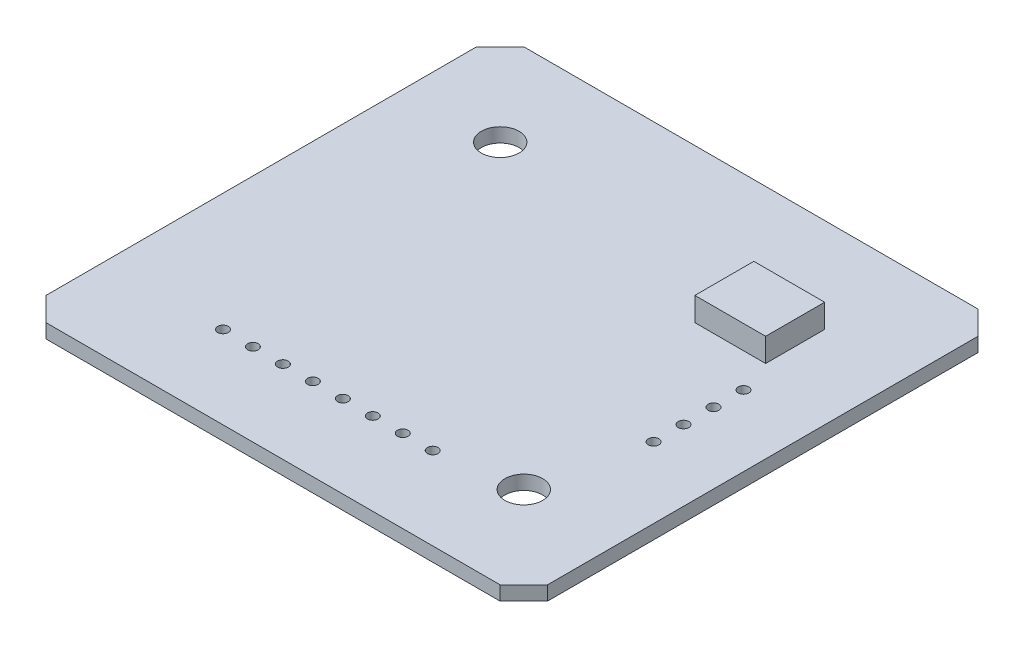
ISO-10303-21;
HEADER;
FILE_DESCRIPTION(('STEP AP214'),'2;1');
FILE_NAME('part.step','',(''),(''),'','','');
FILE_SCHEMA(('AUTOMOTIVE_DESIGN { 1 0 10303 214 1 1 1 1 }'));
ENDSEC;
DATA;
#1=APPLICATION_CONTEXT('core data for automotive mechanical design processes');
#2=APPLICATION_PROTOCOL_DEFINITION('international standard','automotive_design',2000,#1);
#3=PRODUCT_CONTEXT('',#1,'mechanical');
#4=PRODUCT('Part','Part','',(#3));
#5=PRODUCT_RELATED_PRODUCT_CATEGORY('part','',(#4));
#6=PRODUCT_DEFINITION_FORMATION('','',#4);
#7=PRODUCT_DEFINITION_CONTEXT('part definition',#1,'design');
#8=PRODUCT_DEFINITION('design','',#6,#7);
#9=PRODUCT_DEFINITION_SHAPE('','',#8);
#10=(LENGTH_UNIT() NAMED_UNIT(*) SI_UNIT(.MILLI.,.METRE.));
#11=(NAMED_UNIT(*) PLANE_ANGLE_UNIT() SI_UNIT($,.RADIAN.));
#12=(NAMED_UNIT(*) SI_UNIT($,.STERADIAN.) SOLID_ANGLE_UNIT());
#13=UNCERTAINTY_MEASURE_WITH_UNIT(LENGTH_MEASURE(1.E-05),#10,'distance_accuracy_value','');
#14=(GEOMETRIC_REPRESENTATION_CONTEXT(3) GLOBAL_UNCERTAINTY_ASSIGNED_CONTEXT((#13)) GLOBAL_UNIT_ASSIGNED_CONTEXT((#10,
#11,#12)) REPRESENTATION_CONTEXT('',''));
#15=CARTESIAN_POINT('',(0.,0.,0.));
#16=DIRECTION('',(0.,0.,1.));
#17=DIRECTION('',(1.,0.,0.));
#18=AXIS2_PLACEMENT_3D('',#15,#16,#17);
#19=CARTESIAN_POINT('',(0.,1.2,0.));
#20=DIRECTION('',(0.,-1.,0.));
#21=DIRECTION('',(0.,0.,-1.));
#22=AXIS2_PLACEMENT_3D('',#19,#20,#21);
#23=PLANE('',#22);
#24=CARTESIAN_POINT('',(15.25,1.2,-4.37));
#25=DIRECTION('',(0.,1.,0.));
#26=DIRECTION('',(0.,0.,1.));
#27=AXIS2_PLACEMENT_3D('',#24,#25,#26);
#28=CIRCLE('',#27,0.449999999999995);
#29=CARTESIAN_POINT('',(15.25,1.2,-3.92000000000001));
#30=VERTEX_POINT('',#29);
#31=EDGE_CURVE('E154',#30,#30,#28,.T.);
#32=ORIENTED_EDGE('',*,*,#31,.F.);
#33=EDGE_LOOP('',(#32));
#34=FACE_BOUND('',#33,.T.);
#35=CARTESIAN_POINT('',(15.25,1.2,-1.83));
#36=DIRECTION('',(0.,1.,0.));
#37=DIRECTION('',(0.,0.,1.));
#38=AXIS2_PLACEMENT_3D('',#35,#36,#37);
#39=CIRCLE('',#38,0.449999999999997);
#40=CARTESIAN_POINT('',(15.25,1.2,-1.38000000000001));
#41=VERTEX_POINT('',#40);
#42=EDGE_CURVE('E163',#41,#41,#39,.T.);
#43=ORIENTED_EDGE('',*,*,#42,.F.);
#44=EDGE_LOOP('',(#43));
#45=FACE_BOUND('',#44,.T.);
#46=CARTESIAN_POINT('',(15.25,1.2,0.709999999999996));
#47=DIRECTION('',(0.,1.,0.));
#48=DIRECTION('',(0.,0.,1.));
#49=AXIS2_PLACEMENT_3D('',#46,#47,#48);
#50=CIRCLE('',#49,0.449999999999995);
#51=CARTESIAN_POINT('',(15.25,1.2,1.15999999999999));
#52=VERTEX_POINT('',#51);
#53=EDGE_CURVE('E169',#52,#52,#50,.T.);
#54=ORIENTED_EDGE('',*,*,#53,.F.);
#55=EDGE_LOOP('',(#54));
#56=FACE_BOUND('',#55,.T.);
#57=CARTESIAN_POINT('',(15.25,1.2,3.25));
#58=DIRECTION('',(0.,1.,0.));
#59=DIRECTION('',(0.,0.,1.));
#60=AXIS2_PLACEMENT_3D('',#57,#58,#59);
#61=CIRCLE('',#60,0.449999999999997);
#62=CARTESIAN_POINT('',(15.25,1.2,3.69999999999999));
#63=VERTEX_POINT('',#62);
#64=EDGE_CURVE('E175',#63,#63,#61,.T.);
#65=ORIENTED_EDGE('',*,*,#64,.F.);
#66=EDGE_LOOP('',(#65));
#67=FACE_BOUND('',#66,.T.);
#68=CARTESIAN_POINT('',(6.53,1.2,13.25));
#69=DIRECTION('',(0.,1.,0.));
#70=DIRECTION('',(0.,0.,1.));
#71=AXIS2_PLACEMENT_3D('',#68,#69,#70);
#72=CIRCLE('',#71,0.45);
#73=CARTESIAN_POINT('',(6.53,1.2,13.7));
#74=VERTEX_POINT('',#73);
#75=EDGE_CURVE('E181',#74,#74,#72,.T.);
#76=ORIENTED_EDGE('',*,*,#75,.F.);
#77=EDGE_LOOP('',(#76));
#78=FACE_BOUND('',#77,.T.);
#79=CARTESIAN_POINT('',(3.99,1.2,13.25));
#80=DIRECTION('',(0.,1.,0.));
#81=DIRECTION('',(0.,0.,1.));
#82=AXIS2_PLACEMENT_3D('',#79,#80,#81);
#83=CIRCLE('',#82,0.45);
#84=CARTESIAN_POINT('',(3.99,1.2,13.7));
#85=VERTEX_POINT('',#84);
#86=EDGE_CURVE('E187',#85,#85,#83,.T.);
#87=ORIENTED_EDGE('',*,*,#86,.F.);
#88=EDGE_LOOP('',(#87));
#89=FACE_BOUND('',#88,.T.);
#90=CARTESIAN_POINT('',(1.45,1.2,13.25));
#91=DIRECTION('',(0.,1.,0.));
#92=DIRECTION('',(0.,0.,1.));
#93=AXIS2_PLACEMENT_3D('',#90,#91,#92);
#94=CIRCLE('',#93,0.45);
#95=CARTESIAN_POINT('',(1.45,1.2,13.7));
#96=VERTEX_POINT('',#95);
#97=EDGE_CURVE('E193',#96,#96,#94,.T.);
#98=ORIENTED_EDGE('',*,*,#97,.F.);
#99=EDGE_LOOP('',(#98));
#100=FACE_BOUND('',#99,.T.);
#101=CARTESIAN_POINT('',(-1.09,1.2,13.25));
#102=DIRECTION('',(0.,1.,0.));
#103=DIRECTION('',(0.,0.,1.));
#104=AXIS2_PLACEMENT_3D('',#101,#102,#103);
#105=CIRCLE('',#104,0.45);
#106=CARTESIAN_POINT('',(-1.09,1.2,13.7));
#107=VERTEX_POINT('',#106);
#108=EDGE_CURVE('E199',#107,#107,#105,.T.);
#109=ORIENTED_EDGE('',*,*,#108,.F.);
#110=EDGE_LOOP('',(#109));
#111=FACE_BOUND('',#110,.T.);
#112=CARTESIAN_POINT('',(-11.25,1.2,13.25));
#113=DIRECTION('',(0.,1.,0.));
#114=DIRECTION('',(0.,0.,1.));
#115=AXIS2_PLACEMENT_3D('',#112,#113,#114);
#116=CIRCLE('',#115,0.45);
#117=CARTESIAN_POINT('',(-11.25,1.2,13.7));
#118=VERTEX_POINT('',#117);
#119=EDGE_CURVE('E205',#118,#118,#116,.T.);
#120=ORIENTED_EDGE('',*,*,#119,.F.);
#121=EDGE_LOOP('',(#120));
#122=FACE_BOUND('',#121,.T.);
#123=CARTESIAN_POINT('',(-13.25,1.2,-12.25));
#124=DIRECTION('',(0.,1.,0.));
#125=DIRECTION('',(0.,0.,1.));
#126=AXIS2_PLACEMENT_3D('',#123,#124,#125);
#127=CIRCLE('',#126,1.6);
#128=CARTESIAN_POINT('',(-13.25,1.2,-10.65));
#129=VERTEX_POINT('',#128);
#130=EDGE_CURVE('E211',#129,#129,#127,.T.);
#131=ORIENTED_EDGE('',*,*,#130,.F.);
#132=EDGE_LOOP('',(#131));
#133=FACE_BOUND('',#132,.T.);
#134=CARTESIAN_POINT('',(13.25,1.2,12.25));
#135=DIRECTION('',(0.,1.,0.));
#136=DIRECTION('',(0.,0.,1.));
#137=AXIS2_PLACEMENT_3D('',#134,#135,#136);
#138=CIRCLE('',#137,1.6);
#139=CARTESIAN_POINT('',(13.25,1.2,13.85));
#140=VERTEX_POINT('',#139);
#141=EDGE_CURVE('E217',#140,#140,#138,.T.);
#142=ORIENTED_EDGE('',*,*,#141,.F.);
#143=EDGE_LOOP('',(#142));
#144=FACE_BOUND('',#143,.T.);
#145=CARTESIAN_POINT('',(-3.63,1.2,13.25));
#146=DIRECTION('',(0.,1.,0.));
#147=DIRECTION('',(0.,0.,1.));
#148=AXIS2_PLACEMENT_3D('',#145,#146,#147);
#149=CIRCLE('',#148,0.45);
#150=CARTESIAN_POINT('',(-3.63,1.2,13.7));
#151=VERTEX_POINT('',#150);
#152=EDGE_CURVE('E223',#151,#151,#149,.T.);
#153=ORIENTED_EDGE('',*,*,#152,.F.);
#154=EDGE_LOOP('',(#153));
#155=FACE_BOUND('',#154,.T.);
#156=CARTESIAN_POINT('',(-6.17,1.2,13.25));
#157=DIRECTION('',(0.,1.,0.));
#158=DIRECTION('',(0.,0.,1.));
#159=AXIS2_PLACEMENT_3D('',#156,#157,#158);
#160=CIRCLE('',#159,0.45);
#161=CARTESIAN_POINT('',(-6.17,1.2,13.7));
#162=VERTEX_POINT('',#161);
#163=EDGE_CURVE('E229',#162,#162,#160,.T.);
#164=ORIENTED_EDGE('',*,*,#163,.F.);
#165=EDGE_LOOP('',(#164));
#166=FACE_BOUND('',#165,.T.);
#167=CARTESIAN_POINT('',(-8.71,1.2,13.25));
#168=DIRECTION('',(0.,1.,0.));
#169=DIRECTION('',(0.,0.,1.));
#170=AXIS2_PLACEMENT_3D('',#167,#168,#169);
#171=CIRCLE('',#170,0.45);
#172=CARTESIAN_POINT('',(-8.71,1.2,13.7));
#173=VERTEX_POINT('',#172);
#174=EDGE_CURVE('E235',#173,#173,#171,.T.);
#175=ORIENTED_EDGE('',*,*,#174,.F.);
#176=EDGE_LOOP('',(#175));
#177=FACE_BOUND('',#176,.T.);
#178=DIRECTION('',(1.,0.,0.));
#179=VECTOR('',#178,1.);
#180=CARTESIAN_POINT('',(-19.25,1.2,20.25));
#181=LINE('',#180,#179);
#182=CARTESIAN_POINT('',(-19.25,1.2,20.25));
#183=VERTEX_POINT('',#182);
#184=CARTESIAN_POINT('',(19.25,1.2,20.25));
#185=VERTEX_POINT('',#184);
#186=EDGE_CURVE('E241',#183,#185,#181,.T.);
#187=ORIENTED_EDGE('',*,*,#186,.T.);
#188=DIRECTION('',(0.707106781186546,0.,-0.707106781186549));
#189=VECTOR('',#188,1.);
#190=CARTESIAN_POINT('',(19.25,1.2,20.25));
#191=LINE('',#190,#189);
#192=CARTESIAN_POINT('',(21.25,1.2,18.25));
#193=VERTEX_POINT('',#192);
#194=EDGE_CURVE('E244',#185,#193,#191,.T.);
#195=ORIENTED_EDGE('',*,*,#194,.T.);
#196=DIRECTION('',(0.,0.,-1.));
#197=VECTOR('',#196,1.);
#198=CARTESIAN_POINT('',(21.25,1.2,-18.25));
#199=LINE('',#198,#197);
#200=CARTESIAN_POINT('',(21.25,1.2,-18.25));
#201=VERTEX_POINT('',#200);
#202=EDGE_CURVE('E247',#193,#201,#199,.T.);
#203=ORIENTED_EDGE('',*,*,#202,.T.);
#204=DIRECTION('',(-0.707106781186549,0.,-0.707106781186546));
#205=VECTOR('',#204,1.);
#206=CARTESIAN_POINT('',(19.25,1.2,-20.25));
#207=LINE('',#206,#205);
#208=CARTESIAN_POINT('',(19.25,1.2,-20.25));
#209=VERTEX_POINT('',#208);
#210=EDGE_CURVE('E249',#201,#209,#207,.T.);
#211=ORIENTED_EDGE('',*,*,#210,.T.);
#212=DIRECTION('',(-1.,0.,0.));
#213=VECTOR('',#212,1.);
#214=CARTESIAN_POINT('',(-19.25,1.2,-20.25));
#215=LINE('',#214,#213);
#216=CARTESIAN_POINT('',(-19.25,1.2,-20.25));
#217=VERTEX_POINT('',#216);
#218=EDGE_CURVE('E251',#209,#217,#215,.T.);
#219=ORIENTED_EDGE('',*,*,#218,.T.);
#220=DIRECTION('',(-0.707106781186547,0.,0.707106781186548));
#221=VECTOR('',#220,1.);
#222=CARTESIAN_POINT('',(-19.25,1.2,-20.25));
#223=LINE('',#222,#221);
#224=CARTESIAN_POINT('',(-21.25,1.2,-18.25));
#225=VERTEX_POINT('',#224);
#226=EDGE_CURVE('E253',#217,#225,#223,.T.);
#227=ORIENTED_EDGE('',*,*,#226,.T.);
#228=DIRECTION('',(0.,0.,1.));
#229=VECTOR('',#228,1.);
#230=CARTESIAN_POINT('',(-21.25,1.2,-18.25));
#231=LINE('',#230,#229);
#232=CARTESIAN_POINT('',(-21.25,1.2,18.25));
#233=VERTEX_POINT('',#232);
#234=EDGE_CURVE('E255',#225,#233,#231,.T.);
#235=ORIENTED_EDGE('',*,*,#234,.T.);
#236=DIRECTION('',(0.707106781186548,0.,0.707106781186548));
#237=VECTOR('',#236,1.);
#238=CARTESIAN_POINT('',(-21.25,1.2,18.25));
#239=LINE('',#238,#237);
#240=EDGE_CURVE('E257',#233,#183,#239,.T.);
#241=ORIENTED_EDGE('',*,*,#240,.T.);
#242=EDGE_LOOP('',(#187,#195,#203,#211,#219,#227,#235,#241));
#243=FACE_BOUND('',#242,.T.);
#244=DIRECTION('',(0.,0.,1.));
#245=VECTOR('',#244,1.);
#246=CARTESIAN_POINT('',(8.25,1.2,-12.25));
#247=LINE('',#246,#245);
#248=CARTESIAN_POINT('',(8.25,1.2,-12.25));
#249=VERTEX_POINT('',#248);
#250=CARTESIAN_POINT('',(8.25,1.2,-7.25));
#251=VERTEX_POINT('',#250);
#252=EDGE_CURVE('E150',#249,#251,#247,.T.);
#253=ORIENTED_EDGE('',*,*,#252,.F.);
#254=DIRECTION('',(-1.,0.,0.));
#255=VECTOR('',#254,1.);
#256=CARTESIAN_POINT('',(8.25,1.2,-12.25));
#257=LINE('',#256,#255);
#258=CARTESIAN_POINT('',(14.25,1.2,-12.25));
#259=VERTEX_POINT('',#258);
#260=EDGE_CURVE('E147',#259,#249,#257,.T.);
#261=ORIENTED_EDGE('',*,*,#260,.F.);
#262=DIRECTION('',(0.,0.,-1.));
#263=VECTOR('',#262,1.);
#264=CARTESIAN_POINT('',(14.25,1.2,-12.25));
#265=LINE('',#264,#263);
#266=CARTESIAN_POINT('',(14.25,1.2,-7.25));
#267=VERTEX_POINT('',#266);
#268=EDGE_CURVE('E61',#267,#259,#265,.T.);
#269=ORIENTED_EDGE('',*,*,#268,.F.);
#270=DIRECTION('',(1.,0.,0.));
#271=VECTOR('',#270,1.);
#272=CARTESIAN_POINT('',(8.25,1.2,-7.25));
#273=LINE('',#272,#271);
#274=EDGE_CURVE('E56',#251,#267,#273,.T.);
#275=ORIENTED_EDGE('',*,*,#274,.F.);
#276=EDGE_LOOP('',(#253,#261,#269,#275));
#277=FACE_BOUND('',#276,.T.);
#278=ADVANCED_FACE('F41',(#34,#45,#56,#67,#78,#89,#100,#111,#122,#133,#144,#155,#166,#177,#243,
#277),#23,.F.);
#279=CARTESIAN_POINT('',(0.,0.,0.));
#280=DIRECTION('',(0.,-1.,0.));
#281=DIRECTION('',(0.,0.,-1.));
#282=AXIS2_PLACEMENT_3D('',#279,#280,#281);
#283=PLANE('',#282);
#284=CARTESIAN_POINT('',(15.25,0.,-1.83));
#285=DIRECTION('',(0.,1.,0.));
#286=DIRECTION('',(0.,0.,1.));
#287=AXIS2_PLACEMENT_3D('',#284,#285,#286);
#288=CIRCLE('',#287,0.449999999999997);
#289=CARTESIAN_POINT('',(15.25,0.,-1.38000000000001));
#290=VERTEX_POINT('',#289);
#291=EDGE_CURVE('E161',#290,#290,#288,.T.);
#292=ORIENTED_EDGE('',*,*,#291,.T.);
#293=EDGE_LOOP('',(#292));
#294=FACE_BOUND('',#293,.T.);
#295=CARTESIAN_POINT('',(15.25,0.,3.25));
#296=DIRECTION('',(0.,1.,0.));
#297=DIRECTION('',(0.,0.,1.));
#298=AXIS2_PLACEMENT_3D('',#295,#296,#297);
#299=CIRCLE('',#298,0.449999999999997);
#300=CARTESIAN_POINT('',(15.25,0.,3.69999999999999));
#301=VERTEX_POINT('',#300);
#302=EDGE_CURVE('E172',#301,#301,#299,.T.);
#303=ORIENTED_EDGE('',*,*,#302,.T.);
#304=EDGE_LOOP('',(#303));
#305=FACE_BOUND('',#304,.T.);
#306=CARTESIAN_POINT('',(3.99,0.,13.25));
#307=DIRECTION('',(0.,1.,0.));
#308=DIRECTION('',(0.,0.,1.));
#309=AXIS2_PLACEMENT_3D('',#306,#307,#308);
#310=CIRCLE('',#309,0.45);
#311=CARTESIAN_POINT('',(3.99,0.,13.7));
#312=VERTEX_POINT('',#311);
#313=EDGE_CURVE('E184',#312,#312,#310,.T.);
#314=ORIENTED_EDGE('',*,*,#313,.T.);
#315=EDGE_LOOP('',(#314));
#316=FACE_BOUND('',#315,.T.);
#317=CARTESIAN_POINT('',(-1.09,0.,13.25));
#318=DIRECTION('',(0.,1.,0.));
#319=DIRECTION('',(0.,0.,1.));
#320=AXIS2_PLACEMENT_3D('',#317,#318,#319);
#321=CIRCLE('',#320,0.45);
#322=CARTESIAN_POINT('',(-1.09,0.,13.7));
#323=VERTEX_POINT('',#322);
#324=EDGE_CURVE('E196',#323,#323,#321,.T.);
#325=ORIENTED_EDGE('',*,*,#324,.T.);
#326=EDGE_LOOP('',(#325));
#327=FACE_BOUND('',#326,.T.);
#328=CARTESIAN_POINT('',(-13.25,0.,-12.25));
#329=DIRECTION('',(0.,1.,0.));
#330=DIRECTION('',(0.,0.,1.));
#331=AXIS2_PLACEMENT_3D('',#328,#329,#330);
#332=CIRCLE('',#331,1.6);
#333=CARTESIAN_POINT('',(-13.25,0.,-10.65));
#334=VERTEX_POINT('',#333);
#335=EDGE_CURVE('E208',#334,#334,#332,.T.);
#336=ORIENTED_EDGE('',*,*,#335,.T.);
#337=EDGE_LOOP('',(#336));
#338=FACE_BOUND('',#337,.T.);
#339=CARTESIAN_POINT('',(-3.63,0.,13.25));
#340=DIRECTION('',(0.,1.,0.));
#341=DIRECTION('',(0.,0.,1.));
#342=AXIS2_PLACEMENT_3D('',#339,#340,#341);
#343=CIRCLE('',#342,0.45);
#344=CARTESIAN_POINT('',(-3.63,0.,13.7));
#345=VERTEX_POINT('',#344);
#346=EDGE_CURVE('E220',#345,#345,#343,.T.);
#347=ORIENTED_EDGE('',*,*,#346,.T.);
#348=EDGE_LOOP('',(#347));
#349=FACE_BOUND('',#348,.T.);
#350=CARTESIAN_POINT('',(-8.71,0.,13.25));
#351=DIRECTION('',(0.,1.,0.));
#352=DIRECTION('',(0.,0.,1.));
#353=AXIS2_PLACEMENT_3D('',#350,#351,#352);
#354=CIRCLE('',#353,0.45);
#355=CARTESIAN_POINT('',(-8.71,0.,13.7));
#356=VERTEX_POINT('',#355);
#357=EDGE_CURVE('E232',#356,#356,#354,.T.);
#358=ORIENTED_EDGE('',*,*,#357,.T.);
#359=EDGE_LOOP('',(#358));
#360=FACE_BOUND('',#359,.T.);
#361=DIRECTION('',(1.,0.,0.));
#362=VECTOR('',#361,1.);
#363=CARTESIAN_POINT('',(-19.25,0.,20.25));
#364=LINE('',#363,#362);
#365=CARTESIAN_POINT('',(-19.25,0.,20.25));
#366=VERTEX_POINT('',#365);
#367=CARTESIAN_POINT('',(19.25,0.,20.25));
#368=VERTEX_POINT('',#367);
#369=EDGE_CURVE('E238',#366,#368,#364,.T.);
#370=ORIENTED_EDGE('',*,*,#369,.F.);
#371=DIRECTION('',(0.707106781186548,0.,0.707106781186548));
#372=VECTOR('',#371,1.);
#373=CARTESIAN_POINT('',(-21.25,0.,18.25));
#374=LINE('',#373,#372);
#375=CARTESIAN_POINT('',(-21.25,0.,18.25));
#376=VERTEX_POINT('',#375);
#377=EDGE_CURVE('E245',#376,#366,#374,.T.);
#378=ORIENTED_EDGE('',*,*,#377,.F.);
#379=DIRECTION('',(0.,0.,1.));
#380=VECTOR('',#379,1.);
#381=CARTESIAN_POINT('',(-21.25,0.,-18.25));
#382=LINE('',#381,#380);
#383=CARTESIAN_POINT('',(-21.25,0.,-18.25));
#384=VERTEX_POINT('',#383);
#385=EDGE_CURVE('E272',#384,#376,#382,.T.);
#386=ORIENTED_EDGE('',*,*,#385,.F.);
#387=DIRECTION('',(-0.707106781186547,0.,0.707106781186548));
#388=VECTOR('',#387,1.);
#389=CARTESIAN_POINT('',(-19.25,0.,-20.25));
#390=LINE('',#389,#388);
#391=CARTESIAN_POINT('',(-19.25,0.,-20.25));
#392=VERTEX_POINT('',#391);
#393=EDGE_CURVE('E270',#392,#384,#390,.T.);
#394=ORIENTED_EDGE('',*,*,#393,.F.);
#395=DIRECTION('',(-1.,0.,0.));
#396=VECTOR('',#395,1.);
#397=CARTESIAN_POINT('',(-19.25,0.,-20.25));
#398=LINE('',#397,#396);
#399=CARTESIAN_POINT('',(19.25,0.,-20.25));
#400=VERTEX_POINT('',#399);
#401=EDGE_CURVE('E268',#400,#392,#398,.T.);
#402=ORIENTED_EDGE('',*,*,#401,.F.);
#403=DIRECTION('',(-0.707106781186549,0.,-0.707106781186546));
#404=VECTOR('',#403,1.);
#405=CARTESIAN_POINT('',(19.25,0.,-20.25));
#406=LINE('',#405,#404);
#407=CARTESIAN_POINT('',(21.25,0.,-18.25));
#408=VERTEX_POINT('',#407);
#409=EDGE_CURVE('E266',#408,#400,#406,.T.);
#410=ORIENTED_EDGE('',*,*,#409,.F.);
#411=DIRECTION('',(0.,0.,-1.));
#412=VECTOR('',#411,1.);
#413=CARTESIAN_POINT('',(21.25,0.,-18.25));
#414=LINE('',#413,#412);
#415=CARTESIAN_POINT('',(21.25,0.,18.25));
#416=VERTEX_POINT('',#415);
#417=EDGE_CURVE('E264',#416,#408,#414,.T.);
#418=ORIENTED_EDGE('',*,*,#417,.F.);
#419=DIRECTION('',(0.707106781186546,0.,-0.707106781186549));
#420=VECTOR('',#419,1.);
#421=CARTESIAN_POINT('',(19.25,0.,20.25));
#422=LINE('',#421,#420);
#423=EDGE_CURVE('E262',#368,#416,#422,.T.);
#424=ORIENTED_EDGE('',*,*,#423,.F.);
#425=EDGE_LOOP('',(#370,#378,#386,#394,#402,#410,#418,#424));
#426=FACE_BOUND('',#425,.T.);
#427=CARTESIAN_POINT('',(-6.17,0.,13.25));
#428=DIRECTION('',(0.,1.,0.));
#429=DIRECTION('',(0.,0.,1.));
#430=AXIS2_PLACEMENT_3D('',#427,#428,#429);
#431=CIRCLE('',#430,0.45);
#432=CARTESIAN_POINT('',(-6.17,0.,13.7));
#433=VERTEX_POINT('',#432);
#434=EDGE_CURVE('E226',#433,#433,#431,.T.);
#435=ORIENTED_EDGE('',*,*,#434,.T.);
#436=EDGE_LOOP('',(#435));
#437=FACE_BOUND('',#436,.T.);
#438=CARTESIAN_POINT('',(13.25,0.,12.25));
#439=DIRECTION('',(0.,1.,0.));
#440=DIRECTION('',(0.,0.,1.));
#441=AXIS2_PLACEMENT_3D('',#438,#439,#440);
#442=CIRCLE('',#441,1.6);
#443=CARTESIAN_POINT('',(13.25,0.,13.85));
#444=VERTEX_POINT('',#443);
#445=EDGE_CURVE('E214',#444,#444,#442,.T.);
#446=ORIENTED_EDGE('',*,*,#445,.T.);
#447=EDGE_LOOP('',(#446));
#448=FACE_BOUND('',#447,.T.);
#449=CARTESIAN_POINT('',(-11.25,0.,13.25));
#450=DIRECTION('',(0.,1.,0.));
#451=DIRECTION('',(0.,0.,1.));
#452=AXIS2_PLACEMENT_3D('',#449,#450,#451);
#453=CIRCLE('',#452,0.45);
#454=CARTESIAN_POINT('',(-11.25,0.,13.7));
#455=VERTEX_POINT('',#454);
#456=EDGE_CURVE('E202',#455,#455,#453,.T.);
#457=ORIENTED_EDGE('',*,*,#456,.T.);
#458=EDGE_LOOP('',(#457));
#459=FACE_BOUND('',#458,.T.);
#460=CARTESIAN_POINT('',(1.45,0.,13.25));
#461=DIRECTION('',(0.,1.,0.));
#462=DIRECTION('',(0.,0.,1.));
#463=AXIS2_PLACEMENT_3D('',#460,#461,#462);
#464=CIRCLE('',#463,0.45);
#465=CARTESIAN_POINT('',(1.45,0.,13.7));
#466=VERTEX_POINT('',#465);
#467=EDGE_CURVE('E190',#466,#466,#464,.T.);
#468=ORIENTED_EDGE('',*,*,#467,.T.);
#469=EDGE_LOOP('',(#468));
#470=FACE_BOUND('',#469,.T.);
#471=CARTESIAN_POINT('',(6.53,0.,13.25));
#472=DIRECTION('',(0.,1.,0.));
#473=DIRECTION('',(0.,0.,1.));
#474=AXIS2_PLACEMENT_3D('',#471,#472,#473);
#475=CIRCLE('',#474,0.45);
#476=CARTESIAN_POINT('',(6.53,0.,13.7));
#477=VERTEX_POINT('',#476);
#478=EDGE_CURVE('E178',#477,#477,#475,.T.);
#479=ORIENTED_EDGE('',*,*,#478,.T.);
#480=EDGE_LOOP('',(#479));
#481=FACE_BOUND('',#480,.T.);
#482=CARTESIAN_POINT('',(15.25,0.,0.709999999999996));
#483=DIRECTION('',(0.,1.,0.));
#484=DIRECTION('',(0.,0.,1.));
#485=AXIS2_PLACEMENT_3D('',#482,#483,#484);
#486=CIRCLE('',#485,0.449999999999995);
#487=CARTESIAN_POINT('',(15.25,0.,1.15999999999999));
#488=VERTEX_POINT('',#487);
#489=EDGE_CURVE('E166',#488,#488,#486,.T.);
#490=ORIENTED_EDGE('',*,*,#489,.T.);
#491=EDGE_LOOP('',(#490));
#492=FACE_BOUND('',#491,.T.);
#493=CARTESIAN_POINT('',(15.25,0.,-4.37));
#494=DIRECTION('',(0.,1.,0.));
#495=DIRECTION('',(0.,0.,1.));
#496=AXIS2_PLACEMENT_3D('',#493,#494,#495);
#497=CIRCLE('',#496,0.449999999999995);
#498=CARTESIAN_POINT('',(15.25,0.,-3.92000000000001));
#499=VERTEX_POINT('',#498);
#500=EDGE_CURVE('E151',#499,#499,#497,.T.);
#501=ORIENTED_EDGE('',*,*,#500,.T.);
#502=EDGE_LOOP('',(#501));
#503=FACE_BOUND('',#502,.T.);
#504=ADVANCED_FACE('F302',(#294,#305,#316,#327,#338,#349,#360,#426,#437,#448,#459,#470,#481,
#492,#503),#283,.T.);
#505=CARTESIAN_POINT('',(-19.25,1.2,20.25));
#506=DIRECTION('',(0.,0.,-1.));
#507=DIRECTION('',(-1.,0.,0.));
#508=AXIS2_PLACEMENT_3D('',#505,#506,#507);
#509=PLANE('',#508);
#510=ORIENTED_EDGE('',*,*,#369,.T.);
#511=DIRECTION('',(0.,-1.,0.));
#512=VECTOR('',#511,1.);
#513=CARTESIAN_POINT('',(19.25,1.2,20.25));
#514=LINE('',#513,#512);
#515=EDGE_CURVE('E11',#185,#368,#514,.T.);
#516=ORIENTED_EDGE('',*,*,#515,.F.);
#517=ORIENTED_EDGE('',*,*,#186,.F.);
#518=DIRECTION('',(0.,-1.,0.));
#519=VECTOR('',#518,1.);
#520=CARTESIAN_POINT('',(-19.25,1.2,20.25));
#521=LINE('',#520,#519);
#522=EDGE_CURVE('E259',#183,#366,#521,.T.);
#523=ORIENTED_EDGE('',*,*,#522,.T.);
#524=EDGE_LOOP('',(#510,#516,#517,#523));
#525=FACE_BOUND('',#524,.T.);
#526=ADVANCED_FACE('F43',(#525),#509,.F.);
#527=CARTESIAN_POINT('',(19.25,1.2,20.25));
#528=DIRECTION('',(-0.707106781186549,0.,-0.707106781186546));
#529=DIRECTION('',(-0.707106781186546,0.,0.707106781186549));
#530=AXIS2_PLACEMENT_3D('',#527,#528,#529);
#531=PLANE('',#530);
#532=ORIENTED_EDGE('',*,*,#423,.T.);
#533=DIRECTION('',(0.,-1.,0.));
#534=VECTOR('',#533,1.);
#535=CARTESIAN_POINT('',(21.25,1.2,18.25));
#536=LINE('',#535,#534);
#537=EDGE_CURVE('E49',#193,#416,#536,.T.);
#538=ORIENTED_EDGE('',*,*,#537,.F.);
#539=ORIENTED_EDGE('',*,*,#194,.F.);
#540=ORIENTED_EDGE('',*,*,#515,.T.);
#541=EDGE_LOOP('',(#532,#538,#539,#540));
#542=FACE_BOUND('',#541,.T.);
#543=ADVANCED_FACE('F319',(#542),#531,.F.);
#544=CARTESIAN_POINT('',(21.25,1.2,-18.25));
#545=DIRECTION('',(-1.,0.,0.));
#546=DIRECTION('',(0.,0.,1.));
#547=AXIS2_PLACEMENT_3D('',#544,#545,#546);
#548=PLANE('',#547);
#549=ORIENTED_EDGE('',*,*,#417,.T.);
#550=DIRECTION('',(0.,-1.,0.));
#551=VECTOR('',#550,1.);
#552=CARTESIAN_POINT('',(21.25,1.2,-18.25));
#553=LINE('',#552,#551);
#554=EDGE_CURVE('E289',#201,#408,#553,.T.);
#555=ORIENTED_EDGE('',*,*,#554,.F.);
#556=ORIENTED_EDGE('',*,*,#202,.F.);
#557=ORIENTED_EDGE('',*,*,#537,.T.);
#558=EDGE_LOOP('',(#549,#555,#556,#557));
#559=FACE_BOUND('',#558,.T.);
#560=ADVANCED_FACE('F296',(#559),#548,.F.);
#561=CARTESIAN_POINT('',(19.25,1.2,-20.25));
#562=DIRECTION('',(-0.707106781186546,0.,0.707106781186549));
#563=DIRECTION('',(0.707106781186549,0.,0.707106781186546));
#564=AXIS2_PLACEMENT_3D('',#561,#562,#563);
#565=PLANE('',#564);
#566=ORIENTED_EDGE('',*,*,#409,.T.);
#567=DIRECTION('',(0.,-1.,0.));
#568=VECTOR('',#567,1.);
#569=CARTESIAN_POINT('',(19.25,1.2,-20.25));
#570=LINE('',#569,#568);
#571=EDGE_CURVE('E286',#209,#400,#570,.T.);
#572=ORIENTED_EDGE('',*,*,#571,.F.);
#573=ORIENTED_EDGE('',*,*,#210,.F.);
#574=ORIENTED_EDGE('',*,*,#554,.T.);
#575=EDGE_LOOP('',(#566,#572,#573,#574));
#576=FACE_BOUND('',#575,.T.);
#577=ADVANCED_FACE('F308',(#576),#565,.F.);
#578=CARTESIAN_POINT('',(-19.25,1.2,-20.25));
#579=DIRECTION('',(0.,0.,1.));
#580=DIRECTION('',(1.,0.,0.));
#581=AXIS2_PLACEMENT_3D('',#578,#579,#580);
#582=PLANE('',#581);
#583=ORIENTED_EDGE('',*,*,#401,.T.);
#584=DIRECTION('',(0.,-1.,0.));
#585=VECTOR('',#584,1.);
#586=CARTESIAN_POINT('',(-19.25,1.2,-20.25));
#587=LINE('',#586,#585);
#588=EDGE_CURVE('E283',#217,#392,#587,.T.);
#589=ORIENTED_EDGE('',*,*,#588,.F.);
#590=ORIENTED_EDGE('',*,*,#218,.F.);
#591=ORIENTED_EDGE('',*,*,#571,.T.);
#592=EDGE_LOOP('',(#583,#589,#590,#591));
#593=FACE_BOUND('',#592,.T.);
#594=ADVANCED_FACE('F312',(#593),#582,.F.);
#595=CARTESIAN_POINT('',(-19.25,1.2,-20.25));
#596=DIRECTION('',(0.707106781186548,0.,0.707106781186547));
#597=DIRECTION('',(0.707106781186547,0.,-0.707106781186548));
#598=AXIS2_PLACEMENT_3D('',#595,#596,#597);
#599=PLANE('',#598);
#600=ORIENTED_EDGE('',*,*,#393,.T.);
#601=DIRECTION('',(0.,-1.,0.));
#602=VECTOR('',#601,1.);
#603=CARTESIAN_POINT('',(-21.25,1.2,-18.25));
#604=LINE('',#603,#602);
#605=EDGE_CURVE('E280',#225,#384,#604,.T.);
#606=ORIENTED_EDGE('',*,*,#605,.F.);
#607=ORIENTED_EDGE('',*,*,#226,.F.);
#608=ORIENTED_EDGE('',*,*,#588,.T.);
#609=EDGE_LOOP('',(#600,#606,#607,#608));
#610=FACE_BOUND('',#609,.T.);
#611=ADVANCED_FACE('F332',(#610),#599,.F.);
#612=CARTESIAN_POINT('',(-21.25,1.2,-18.25));
#613=DIRECTION('',(1.,0.,0.));
#614=DIRECTION('',(0.,0.,-1.));
#615=AXIS2_PLACEMENT_3D('',#612,#613,#614);
#616=PLANE('',#615);
#617=ORIENTED_EDGE('',*,*,#385,.T.);
#618=DIRECTION('',(0.,-1.,0.));
#619=VECTOR('',#618,1.);
#620=CARTESIAN_POINT('',(-21.25,1.2,18.25));
#621=LINE('',#620,#619);
#622=EDGE_CURVE('E277',#233,#376,#621,.T.);
#623=ORIENTED_EDGE('',*,*,#622,.F.);
#624=ORIENTED_EDGE('',*,*,#234,.F.);
#625=ORIENTED_EDGE('',*,*,#605,.T.);
#626=EDGE_LOOP('',(#617,#623,#624,#625));
#627=FACE_BOUND('',#626,.T.);
#628=ADVANCED_FACE('F330',(#627),#616,.F.);
#629=CARTESIAN_POINT('',(-21.25,1.2,18.25));
#630=DIRECTION('',(0.707106781186548,0.,-0.707106781186548));
#631=DIRECTION('',(-0.707106781186548,0.,-0.707106781186548));
#632=AXIS2_PLACEMENT_3D('',#629,#630,#631);
#633=PLANE('',#632);
#634=ORIENTED_EDGE('',*,*,#377,.T.);
#635=ORIENTED_EDGE('',*,*,#522,.F.);
#636=ORIENTED_EDGE('',*,*,#240,.F.);
#637=ORIENTED_EDGE('',*,*,#622,.T.);
#638=EDGE_LOOP('',(#634,#635,#636,#637));
#639=FACE_BOUND('',#638,.T.);
#640=ADVANCED_FACE('F325',(#639),#633,.F.);
#641=CARTESIAN_POINT('',(-8.71,1.2,13.25));
#642=DIRECTION('',(0.,-1.,0.));
#643=DIRECTION('',(0.,0.,-1.));
#644=AXIS2_PLACEMENT_3D('',#641,#642,#643);
#645=CYLINDRICAL_SURFACE('',#644,0.45);
#646=ORIENTED_EDGE('',*,*,#174,.T.);
#647=EDGE_LOOP('',(#646));
#648=FACE_BOUND('',#647,.T.);
#649=ORIENTED_EDGE('',*,*,#357,.F.);
#650=EDGE_LOOP('',(#649));
#651=FACE_BOUND('',#650,.T.);
#652=ADVANCED_FACE('F354',(#648,#651),#645,.F.);
#653=CARTESIAN_POINT('',(-6.17,1.2,13.25));
#654=DIRECTION('',(0.,-1.,0.));
#655=DIRECTION('',(0.,0.,-1.));
#656=AXIS2_PLACEMENT_3D('',#653,#654,#655);
#657=CYLINDRICAL_SURFACE('',#656,0.45);
#658=ORIENTED_EDGE('',*,*,#163,.T.);
#659=EDGE_LOOP('',(#658));
#660=FACE_BOUND('',#659,.T.);
#661=ORIENTED_EDGE('',*,*,#434,.F.);
#662=EDGE_LOOP('',(#661));
#663=FACE_BOUND('',#662,.T.);
#664=ADVANCED_FACE('F361',(#660,#663),#657,.F.);
#665=CARTESIAN_POINT('',(-3.63,1.2,13.25));
#666=DIRECTION('',(0.,-1.,0.));
#667=DIRECTION('',(0.,0.,-1.));
#668=AXIS2_PLACEMENT_3D('',#665,#666,#667);
#669=CYLINDRICAL_SURFACE('',#668,0.45);
#670=ORIENTED_EDGE('',*,*,#152,.T.);
#671=EDGE_LOOP('',(#670));
#672=FACE_BOUND('',#671,.T.);
#673=ORIENTED_EDGE('',*,*,#346,.F.);
#674=EDGE_LOOP('',(#673));
#675=FACE_BOUND('',#674,.T.);
#676=ADVANCED_FACE('F366',(#672,#675),#669,.F.);
#677=CARTESIAN_POINT('',(13.25,1.2,12.25));
#678=DIRECTION('',(0.,-1.,0.));
#679=DIRECTION('',(0.,0.,-1.));
#680=AXIS2_PLACEMENT_3D('',#677,#678,#679);
#681=CYLINDRICAL_SURFACE('',#680,1.6);
#682=ORIENTED_EDGE('',*,*,#141,.T.);
#683=EDGE_LOOP('',(#682));
#684=FACE_BOUND('',#683,.T.);
#685=ORIENTED_EDGE('',*,*,#445,.F.);
#686=EDGE_LOOP('',(#685));
#687=FACE_BOUND('',#686,.T.);
#688=ADVANCED_FACE('F376',(#684,#687),#681,.F.);
#689=CARTESIAN_POINT('',(-13.25,1.2,-12.25));
#690=DIRECTION('',(0.,-1.,0.));
#691=DIRECTION('',(0.,0.,-1.));
#692=AXIS2_PLACEMENT_3D('',#689,#690,#691);
#693=CYLINDRICAL_SURFACE('',#692,1.6);
#694=ORIENTED_EDGE('',*,*,#130,.T.);
#695=EDGE_LOOP('',(#694));
#696=FACE_BOUND('',#695,.T.);
#697=ORIENTED_EDGE('',*,*,#335,.F.);
#698=EDGE_LOOP('',(#697));
#699=FACE_BOUND('',#698,.T.);
#700=ADVANCED_FACE('F383',(#696,#699),#693,.F.);
#701=CARTESIAN_POINT('',(-11.25,1.2,13.25));
#702=DIRECTION('',(0.,-1.,0.));
#703=DIRECTION('',(0.,0.,-1.));
#704=AXIS2_PLACEMENT_3D('',#701,#702,#703);
#705=CYLINDRICAL_SURFACE('',#704,0.45);
#706=ORIENTED_EDGE('',*,*,#119,.T.);
#707=EDGE_LOOP('',(#706));
#708=FACE_BOUND('',#707,.T.);
#709=ORIENTED_EDGE('',*,*,#456,.F.);
#710=EDGE_LOOP('',(#709));
#711=FACE_BOUND('',#710,.T.);
#712=ADVANCED_FACE('F387',(#708,#711),#705,.F.);
#713=CARTESIAN_POINT('',(-1.09,1.2,13.25));
#714=DIRECTION('',(0.,-1.,0.));
#715=DIRECTION('',(0.,0.,-1.));
#716=AXIS2_PLACEMENT_3D('',#713,#714,#715);
#717=CYLINDRICAL_SURFACE('',#716,0.45);
#718=ORIENTED_EDGE('',*,*,#108,.T.);
#719=EDGE_LOOP('',(#718));
#720=FACE_BOUND('',#719,.T.);
#721=ORIENTED_EDGE('',*,*,#324,.F.);
#722=EDGE_LOOP('',(#721));
#723=FACE_BOUND('',#722,.T.);
#724=ADVANCED_FACE('F391',(#720,#723),#717,.F.);
#725=CARTESIAN_POINT('',(1.45,1.2,13.25));
#726=DIRECTION('',(0.,-1.,0.));
#727=DIRECTION('',(0.,0.,-1.));
#728=AXIS2_PLACEMENT_3D('',#725,#726,#727);
#729=CYLINDRICAL_SURFACE('',#728,0.45);
#730=ORIENTED_EDGE('',*,*,#97,.T.);
#731=EDGE_LOOP('',(#730));
#732=FACE_BOUND('',#731,.T.);
#733=ORIENTED_EDGE('',*,*,#467,.F.);
#734=EDGE_LOOP('',(#733));
#735=FACE_BOUND('',#734,.T.);
#736=ADVANCED_FACE('F395',(#732,#735),#729,.F.);
#737=CARTESIAN_POINT('',(3.99,1.2,13.25));
#738=DIRECTION('',(0.,-1.,0.));
#739=DIRECTION('',(0.,0.,-1.));
#740=AXIS2_PLACEMENT_3D('',#737,#738,#739);
#741=CYLINDRICAL_SURFACE('',#740,0.45);
#742=ORIENTED_EDGE('',*,*,#86,.T.);
#743=EDGE_LOOP('',(#742));
#744=FACE_BOUND('',#743,.T.);
#745=ORIENTED_EDGE('',*,*,#313,.F.);
#746=EDGE_LOOP('',(#745));
#747=FACE_BOUND('',#746,.T.);
#748=ADVANCED_FACE('F399',(#744,#747),#741,.F.);
#749=CARTESIAN_POINT('',(6.53,1.2,13.25));
#750=DIRECTION('',(0.,-1.,0.));
#751=DIRECTION('',(0.,0.,-1.));
#752=AXIS2_PLACEMENT_3D('',#749,#750,#751);
#753=CYLINDRICAL_SURFACE('',#752,0.45);
#754=ORIENTED_EDGE('',*,*,#75,.T.);
#755=EDGE_LOOP('',(#754));
#756=FACE_BOUND('',#755,.T.);
#757=ORIENTED_EDGE('',*,*,#478,.F.);
#758=EDGE_LOOP('',(#757));
#759=FACE_BOUND('',#758,.T.);
#760=ADVANCED_FACE('F403',(#756,#759),#753,.F.);
#761=CARTESIAN_POINT('',(15.25,1.2,3.25));
#762=DIRECTION('',(0.,-1.,0.));
#763=DIRECTION('',(0.,0.,-1.));
#764=AXIS2_PLACEMENT_3D('',#761,#762,#763);
#765=CYLINDRICAL_SURFACE('',#764,0.449999999999997);
#766=ORIENTED_EDGE('',*,*,#64,.T.);
#767=EDGE_LOOP('',(#766));
#768=FACE_BOUND('',#767,.T.);
#769=ORIENTED_EDGE('',*,*,#302,.F.);
#770=EDGE_LOOP('',(#769));
#771=FACE_BOUND('',#770,.T.);
#772=ADVANCED_FACE('F407',(#768,#771),#765,.F.);
#773=CARTESIAN_POINT('',(15.25,1.2,0.709999999999996));
#774=DIRECTION('',(0.,-1.,0.));
#775=DIRECTION('',(0.,0.,-1.));
#776=AXIS2_PLACEMENT_3D('',#773,#774,#775);
#777=CYLINDRICAL_SURFACE('',#776,0.449999999999995);
#778=ORIENTED_EDGE('',*,*,#53,.T.);
#779=EDGE_LOOP('',(#778));
#780=FACE_BOUND('',#779,.T.);
#781=ORIENTED_EDGE('',*,*,#489,.F.);
#782=EDGE_LOOP('',(#781));
#783=FACE_BOUND('',#782,.T.);
#784=ADVANCED_FACE('F411',(#780,#783),#777,.F.);
#785=CARTESIAN_POINT('',(15.25,1.2,-1.83));
#786=DIRECTION('',(0.,-1.,0.));
#787=DIRECTION('',(0.,0.,-1.));
#788=AXIS2_PLACEMENT_3D('',#785,#786,#787);
#789=CYLINDRICAL_SURFACE('',#788,0.449999999999997);
#790=ORIENTED_EDGE('',*,*,#42,.T.);
#791=EDGE_LOOP('',(#790));
#792=FACE_BOUND('',#791,.T.);
#793=ORIENTED_EDGE('',*,*,#291,.F.);
#794=EDGE_LOOP('',(#793));
#795=FACE_BOUND('',#794,.T.);
#796=ADVANCED_FACE('F415',(#792,#795),#789,.F.);
#797=CARTESIAN_POINT('',(15.25,1.2,-4.37));
#798=DIRECTION('',(0.,-1.,0.));
#799=DIRECTION('',(0.,0.,-1.));
#800=AXIS2_PLACEMENT_3D('',#797,#798,#799);
#801=CYLINDRICAL_SURFACE('',#800,0.449999999999995);
#802=ORIENTED_EDGE('',*,*,#31,.T.);
#803=EDGE_LOOP('',(#802));
#804=FACE_BOUND('',#803,.T.);
#805=ORIENTED_EDGE('',*,*,#500,.F.);
#806=EDGE_LOOP('',(#805));
#807=FACE_BOUND('',#806,.T.);
#808=ADVANCED_FACE('F419',(#804,#807),#801,.F.);
#809=CARTESIAN_POINT('',(8.25,3.2,-12.25));
#810=DIRECTION('',(1.,0.,0.));
#811=DIRECTION('',(0.,0.,-1.));
#812=AXIS2_PLACEMENT_3D('',#809,#810,#811);
#813=PLANE('',#812);
#814=ORIENTED_EDGE('',*,*,#252,.T.);
#815=DIRECTION('',(0.,-1.,0.));
#816=VECTOR('',#815,1.);
#817=CARTESIAN_POINT('',(8.25,3.2,-7.25));
#818=LINE('',#817,#816);
#819=CARTESIAN_POINT('',(8.25,3.2,-7.25));
#820=VERTEX_POINT('',#819);
#821=EDGE_CURVE('E131',#820,#251,#818,.T.);
#822=ORIENTED_EDGE('',*,*,#821,.F.);
#823=DIRECTION('',(0.,0.,1.));
#824=VECTOR('',#823,1.);
#825=CARTESIAN_POINT('',(8.25,3.2,-12.25));
#826=LINE('',#825,#824);
#827=CARTESIAN_POINT('',(8.25,3.2,-12.25));
#828=VERTEX_POINT('',#827);
#829=EDGE_CURVE('E138',#828,#820,#826,.T.);
#830=ORIENTED_EDGE('',*,*,#829,.F.);
#831=DIRECTION('',(0.,-1.,0.));
#832=VECTOR('',#831,1.);
#833=CARTESIAN_POINT('',(8.25,3.2,-12.25));
#834=LINE('',#833,#832);
#835=EDGE_CURVE('E607',#828,#249,#834,.T.);
#836=ORIENTED_EDGE('',*,*,#835,.T.);
#837=EDGE_LOOP('',(#814,#822,#830,#836));
#838=FACE_BOUND('',#837,.T.);
#839=ADVANCED_FACE('F149',(#838),#813,.F.);
#840=CARTESIAN_POINT('',(8.25,3.2,-7.25));
#841=DIRECTION('',(0.,0.,-1.));
#842=DIRECTION('',(-1.,0.,0.));
#843=AXIS2_PLACEMENT_3D('',#840,#841,#842);
#844=PLANE('',#843);
#845=ORIENTED_EDGE('',*,*,#274,.T.);
#846=DIRECTION('',(0.,-1.,0.));
#847=VECTOR('',#846,1.);
#848=CARTESIAN_POINT('',(14.25,3.2,-7.25));
#849=LINE('',#848,#847);
#850=CARTESIAN_POINT('',(14.25,3.2,-7.25));
#851=VERTEX_POINT('',#850);
#852=EDGE_CURVE('E134',#851,#267,#849,.T.);
#853=ORIENTED_EDGE('',*,*,#852,.F.);
#854=DIRECTION('',(1.,0.,0.));
#855=VECTOR('',#854,1.);
#856=CARTESIAN_POINT('',(8.25,3.2,-7.25));
#857=LINE('',#856,#855);
#858=EDGE_CURVE('E127',#820,#851,#857,.T.);
#859=ORIENTED_EDGE('',*,*,#858,.F.);
#860=ORIENTED_EDGE('',*,*,#821,.T.);
#861=EDGE_LOOP('',(#845,#853,#859,#860));
#862=FACE_BOUND('',#861,.T.);
#863=ADVANCED_FACE('F129',(#862),#844,.F.);
#864=CARTESIAN_POINT('',(14.25,3.2,-12.25));
#865=DIRECTION('',(-1.,0.,0.));
#866=DIRECTION('',(0.,0.,1.));
#867=AXIS2_PLACEMENT_3D('',#864,#865,#866);
#868=PLANE('',#867);
#869=ORIENTED_EDGE('',*,*,#268,.T.);
#870=DIRECTION('',(0.,-1.,0.));
#871=VECTOR('',#870,1.);
#872=CARTESIAN_POINT('',(14.25,3.2,-12.25));
#873=LINE('',#872,#871);
#874=CARTESIAN_POINT('',(14.25,3.2,-12.25));
#875=VERTEX_POINT('',#874);
#876=EDGE_CURVE('E156',#875,#259,#873,.T.);
#877=ORIENTED_EDGE('',*,*,#876,.F.);
#878=DIRECTION('',(0.,0.,-1.));
#879=VECTOR('',#878,1.);
#880=CARTESIAN_POINT('',(14.25,3.2,-12.25));
#881=LINE('',#880,#879);
#882=EDGE_CURVE('E137',#851,#875,#881,.T.);
#883=ORIENTED_EDGE('',*,*,#882,.F.);
#884=ORIENTED_EDGE('',*,*,#852,.T.);
#885=EDGE_LOOP('',(#869,#877,#883,#884));
#886=FACE_BOUND('',#885,.T.);
#887=ADVANCED_FACE('F426',(#886),#868,.F.);
#888=CARTESIAN_POINT('',(8.25,3.2,-12.25));
#889=DIRECTION('',(0.,0.,1.));
#890=DIRECTION('',(1.,0.,0.));
#891=AXIS2_PLACEMENT_3D('',#888,#889,#890);
#892=PLANE('',#891);
#893=ORIENTED_EDGE('',*,*,#260,.T.);
#894=ORIENTED_EDGE('',*,*,#835,.F.);
#895=DIRECTION('',(-1.,0.,0.));
#896=VECTOR('',#895,1.);
#897=CARTESIAN_POINT('',(8.25,3.2,-12.25));
#898=LINE('',#897,#896);
#899=EDGE_CURVE('E143',#875,#828,#898,.T.);
#900=ORIENTED_EDGE('',*,*,#899,.F.);
#901=ORIENTED_EDGE('',*,*,#876,.T.);
#902=EDGE_LOOP('',(#893,#894,#900,#901));
#903=FACE_BOUND('',#902,.T.);
#904=ADVANCED_FACE('F429',(#903),#892,.F.);
#905=CARTESIAN_POINT('',(0.,3.2,0.));
#906=DIRECTION('',(0.,1.,0.));
#907=DIRECTION('',(0.,0.,1.));
#908=AXIS2_PLACEMENT_3D('',#905,#906,#907);
#909=PLANE('',#908);
#910=ORIENTED_EDGE('',*,*,#829,.T.);
#911=ORIENTED_EDGE('',*,*,#858,.T.);
#912=ORIENTED_EDGE('',*,*,#882,.T.);
#913=ORIENTED_EDGE('',*,*,#899,.T.);
#914=EDGE_LOOP('',(#910,#911,#912,#913));
#915=FACE_BOUND('',#914,.T.);
#916=ADVANCED_FACE('F141',(#915),#909,.T.);
#917=CLOSED_SHELL('',(#278,#504,#526,#543,#560,#577,#594,#611,#628,#640,#652,#664,#676,#688,
#700,#712,#724,#736,#748,#760,#772,#784,#796,#808,#839,#863,#887,#904,#916));
#918=MANIFOLD_SOLID_BREP('B2',#917);
#919=ADVANCED_BREP_SHAPE_REPRESENTATION('',(#18,#918),#14);
#920=SHAPE_DEFINITION_REPRESENTATION(#9,#919);
ENDSEC;
END-ISO-10303-21;
